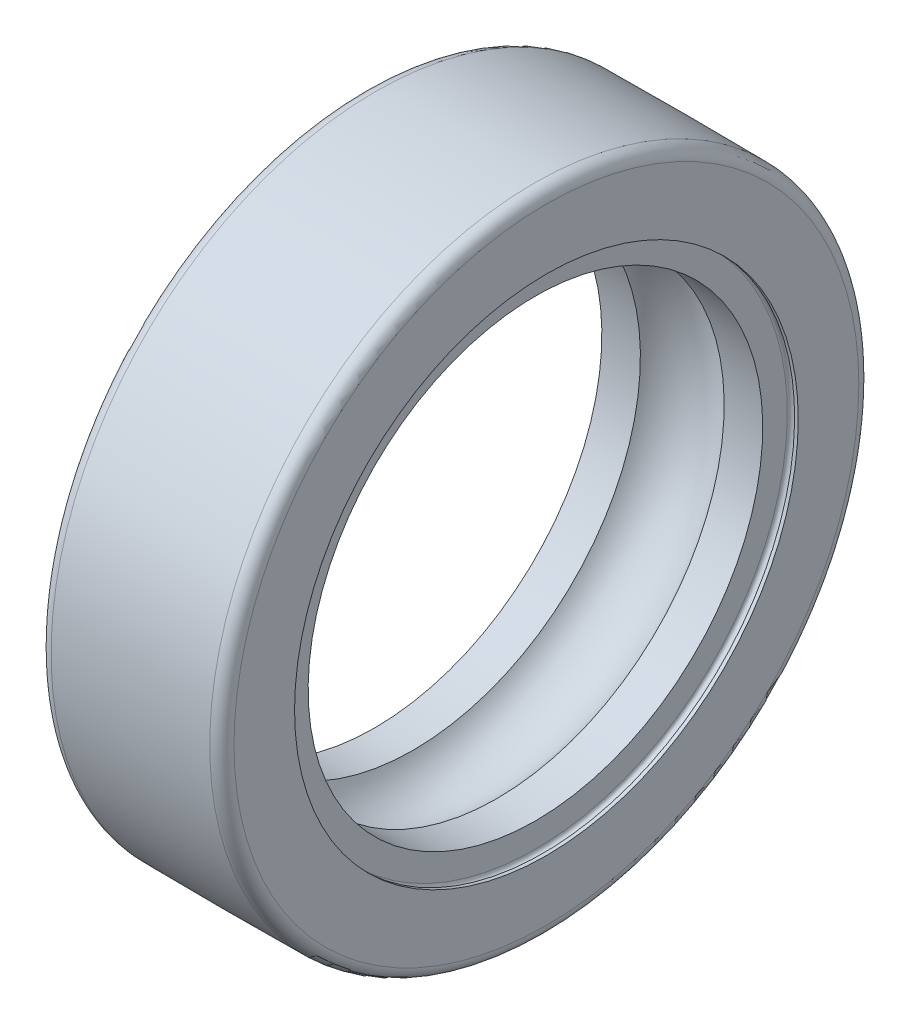
ISO-10303-21;
HEADER;
FILE_DESCRIPTION(('STEP AP214'),'2;1');
FILE_NAME('part.step','',(''),(''),'','','');
FILE_SCHEMA(('AUTOMOTIVE_DESIGN { 1 0 10303 214 1 1 1 1 }'));
ENDSEC;
DATA;
#1=APPLICATION_CONTEXT('core data for automotive mechanical design processes');
#2=APPLICATION_PROTOCOL_DEFINITION('international standard','automotive_design',2000,#1);
#3=PRODUCT_CONTEXT('',#1,'mechanical');
#4=PRODUCT('Part','Part','',(#3));
#5=PRODUCT_RELATED_PRODUCT_CATEGORY('part','',(#4));
#6=PRODUCT_DEFINITION_FORMATION('','',#4);
#7=PRODUCT_DEFINITION_CONTEXT('part definition',#1,'design');
#8=PRODUCT_DEFINITION('design','',#6,#7);
#9=PRODUCT_DEFINITION_SHAPE('','',#8);
#10=(LENGTH_UNIT() NAMED_UNIT(*) SI_UNIT(.MILLI.,.METRE.));
#11=(NAMED_UNIT(*) PLANE_ANGLE_UNIT() SI_UNIT($,.RADIAN.));
#12=(NAMED_UNIT(*) SI_UNIT($,.STERADIAN.) SOLID_ANGLE_UNIT());
#13=UNCERTAINTY_MEASURE_WITH_UNIT(LENGTH_MEASURE(1.E-05),#10,'distance_accuracy_value','');
#14=(GEOMETRIC_REPRESENTATION_CONTEXT(3) GLOBAL_UNCERTAINTY_ASSIGNED_CONTEXT((#13)) GLOBAL_UNIT_ASSIGNED_CONTEXT((#10,
#11,#12)) REPRESENTATION_CONTEXT('',''));
#15=CARTESIAN_POINT('',(0.,0.,0.));
#16=DIRECTION('',(0.,0.,1.));
#17=DIRECTION('',(1.,0.,0.));
#18=AXIS2_PLACEMENT_3D('',#15,#16,#17);
#19=CARTESIAN_POINT('',(4.5,0.,0.));
#20=DIRECTION('',(-1.,0.,0.));
#21=DIRECTION('',(0.,1.,0.));
#22=AXIS2_PLACEMENT_3D('',#19,#20,#21);
#23=CYLINDRICAL_SURFACE('',#22,11.1905);
#24=CARTESIAN_POINT('',(2.43799351358925,0.,0.));
#25=DIRECTION('',(1.,0.,0.));
#26=DIRECTION('',(0.,1.,0.));
#27=AXIS2_PLACEMENT_3D('',#24,#25,#26);
#28=CIRCLE('',#27,11.1905);
#29=CARTESIAN_POINT('',(2.43799351358925,-11.1905,0.));
#30=VERTEX_POINT('',#29);
#31=EDGE_CURVE('E122',#30,#30,#28,.T.);
#32=ORIENTED_EDGE('',*,*,#31,.T.);
#33=EDGE_LOOP('',(#32));
#34=FACE_BOUND('',#33,.T.);
#35=CARTESIAN_POINT('',(0.54,0.,0.));
#36=DIRECTION('',(-1.,0.,0.));
#37=DIRECTION('',(0.,1.,0.));
#38=AXIS2_PLACEMENT_3D('',#35,#36,#37);
#39=CIRCLE('',#38,11.1905);
#40=CARTESIAN_POINT('',(0.54,-11.1905,0.));
#41=VERTEX_POINT('',#40);
#42=EDGE_CURVE('E87',#41,#41,#39,.T.);
#43=ORIENTED_EDGE('',*,*,#42,.T.);
#44=EDGE_LOOP('',(#43));
#45=FACE_BOUND('',#44,.T.);
#46=ADVANCED_FACE('F41',(#34,#45),#23,.F.);
#47=CARTESIAN_POINT('',(9.,13.2857292422513,0.));
#48=DIRECTION('',(1.,0.,0.));
#49=DIRECTION('',(0.,1.,0.));
#50=AXIS2_PLACEMENT_3D('',#47,#48,#49);
#51=PLANE('',#50);
#52=CARTESIAN_POINT('',(9.,0.,0.));
#53=DIRECTION('',(1.,0.,0.));
#54=DIRECTION('',(0.,1.,0.));
#55=AXIS2_PLACEMENT_3D('',#52,#53,#54);
#56=CIRCLE('',#55,15.3809584845026);
#57=CARTESIAN_POINT('',(9.,15.3809584845026,0.));
#58=VERTEX_POINT('',#57);
#59=EDGE_CURVE('E11',#58,#58,#56,.T.);
#60=ORIENTED_EDGE('',*,*,#59,.T.);
#61=EDGE_LOOP('',(#60));
#62=FACE_BOUND('',#61,.T.);
#63=CARTESIAN_POINT('',(9.,0.,0.));
#64=DIRECTION('',(-1.,0.,0.));
#65=DIRECTION('',(0.,1.,0.));
#66=AXIS2_PLACEMENT_3D('',#63,#64,#65);
#67=CIRCLE('',#66,12.4);
#68=CARTESIAN_POINT('',(9.,-12.4,0.));
#69=VERTEX_POINT('',#68);
#70=EDGE_CURVE('E42',#69,#69,#67,.T.);
#71=ORIENTED_EDGE('',*,*,#70,.T.);
#72=EDGE_LOOP('',(#71));
#73=FACE_BOUND('',#72,.T.);
#74=ADVANCED_FACE('F143',(#62,#73),#51,.T.);
#75=CARTESIAN_POINT('',(8.4,0.,0.));
#76=DIRECTION('',(1.,0.,0.));
#77=DIRECTION('',(0.,0.,-1.));
#78=AXIS2_PLACEMENT_3D('',#75,#76,#77);
#79=TOROIDAL_SURFACE('',#78,15.3809584845026,0.6);
#80=CARTESIAN_POINT('',(8.40585878818225,0.,0.));
#81=DIRECTION('',(1.,0.,0.));
#82=DIRECTION('',(0.,1.,0.));
#83=AXIS2_PLACEMENT_3D('',#80,#81,#82);
#84=CIRCLE('',#83,15.9809298793216);
#85=CARTESIAN_POINT('',(8.40585878818225,15.9809298793216,0.));
#86=VERTEX_POINT('',#85);
#87=EDGE_CURVE('E49',#86,#86,#84,.T.);
#88=ORIENTED_EDGE('',*,*,#87,.T.);
#89=EDGE_LOOP('',(#88));
#90=FACE_BOUND('',#89,.T.);
#91=ORIENTED_EDGE('',*,*,#59,.F.);
#92=EDGE_LOOP('',(#91));
#93=FACE_BOUND('',#92,.T.);
#94=ADVANCED_FACE('F149',(#90,#93),#79,.T.);
#95=CARTESIAN_POINT('',(4.49999999999993,0.,0.));
#96=DIRECTION('',(1.,0.,0.));
#97=DIRECTION('',(0.,0.,1.));
#98=AXIS2_PLACEMENT_3D('',#95,#96,#97);
#99=DEGENERATE_TOROIDAL_SURFACE('',#98,384.,400.,.F.);
#100=CARTESIAN_POINT('',(0.594141211817752,0.,0.));
#101=DIRECTION('',(1.,0.,0.));
#102=DIRECTION('',(0.,1.,0.));
#103=AXIS2_PLACEMENT_3D('',#100,#101,#102);
#104=CIRCLE('',#103,15.9809298793216);
#105=CARTESIAN_POINT('',(0.594141211817752,15.9809298793216,0.));
#106=VERTEX_POINT('',#105);
#107=EDGE_CURVE('E106',#106,#106,#104,.T.);
#108=ORIENTED_EDGE('',*,*,#107,.T.);
#109=EDGE_LOOP('',(#108));
#110=FACE_BOUND('',#109,.T.);
#111=ORIENTED_EDGE('',*,*,#87,.F.);
#112=EDGE_LOOP('',(#111));
#113=FACE_BOUND('',#112,.T.);
#114=ADVANCED_FACE('F155',(#110,#113),#99,.F.);
#115=CARTESIAN_POINT('',(0.6,0.,0.));
#116=DIRECTION('',(1.,0.,0.));
#117=DIRECTION('',(0.,0.,-1.));
#118=AXIS2_PLACEMENT_3D('',#115,#116,#117);
#119=TOROIDAL_SURFACE('',#118,15.3809584845026,0.6);
#120=CARTESIAN_POINT('',(0.,0.,0.));
#121=DIRECTION('',(1.,0.,0.));
#122=DIRECTION('',(0.,1.,0.));
#123=AXIS2_PLACEMENT_3D('',#120,#121,#122);
#124=CIRCLE('',#123,15.3809584845026);
#125=CARTESIAN_POINT('',(0.,15.3809584845026,0.));
#126=VERTEX_POINT('',#125);
#127=EDGE_CURVE('E110',#126,#126,#124,.T.);
#128=ORIENTED_EDGE('',*,*,#127,.T.);
#129=EDGE_LOOP('',(#128));
#130=FACE_BOUND('',#129,.T.);
#131=ORIENTED_EDGE('',*,*,#107,.F.);
#132=EDGE_LOOP('',(#131));
#133=FACE_BOUND('',#132,.T.);
#134=ADVANCED_FACE('F170',(#130,#133),#119,.T.);
#135=CARTESIAN_POINT('',(0.,13.2857292422513,0.));
#136=DIRECTION('',(-1.,0.,0.));
#137=DIRECTION('',(0.,-1.,0.));
#138=AXIS2_PLACEMENT_3D('',#135,#136,#137);
#139=PLANE('',#138);
#140=ORIENTED_EDGE('',*,*,#127,.F.);
#141=EDGE_LOOP('',(#140));
#142=FACE_BOUND('',#141,.T.);
#143=CARTESIAN_POINT('',(0.,0.,0.));
#144=DIRECTION('',(1.,0.,0.));
#145=DIRECTION('',(0.,1.,0.));
#146=AXIS2_PLACEMENT_3D('',#143,#144,#145);
#147=CIRCLE('',#146,12.4);
#148=CARTESIAN_POINT('',(0.,-12.4,0.));
#149=VERTEX_POINT('',#148);
#150=EDGE_CURVE('E83',#149,#149,#147,.T.);
#151=ORIENTED_EDGE('',*,*,#150,.T.);
#152=EDGE_LOOP('',(#151));
#153=FACE_BOUND('',#152,.T.);
#154=ADVANCED_FACE('F137',(#142,#153),#139,.T.);
#155=CARTESIAN_POINT('',(4.5,0.,0.));
#156=DIRECTION('',(-1.,0.,0.));
#157=DIRECTION('',(0.,1.,0.));
#158=AXIS2_PLACEMENT_3D('',#155,#156,#157);
#159=CYLINDRICAL_SURFACE('',#158,11.1905);
#160=CARTESIAN_POINT('',(6.56200648641075,0.,0.));
#161=DIRECTION('',(-1.,0.,0.));
#162=DIRECTION('',(0.,1.,0.));
#163=AXIS2_PLACEMENT_3D('',#160,#161,#162);
#164=CIRCLE('',#163,11.1905);
#165=CARTESIAN_POINT('',(6.56200648641075,-11.1905,0.));
#166=VERTEX_POINT('',#165);
#167=EDGE_CURVE('E108',#166,#166,#164,.T.);
#168=ORIENTED_EDGE('',*,*,#167,.T.);
#169=EDGE_LOOP('',(#168));
#170=FACE_BOUND('',#169,.T.);
#171=CARTESIAN_POINT('',(8.46,0.,0.));
#172=DIRECTION('',(1.,0.,0.));
#173=DIRECTION('',(0.,1.,0.));
#174=AXIS2_PLACEMENT_3D('',#171,#172,#173);
#175=CIRCLE('',#174,11.1905);
#176=CARTESIAN_POINT('',(8.46,-11.1905,0.));
#177=VERTEX_POINT('',#176);
#178=EDGE_CURVE('E105',#177,#177,#175,.T.);
#179=ORIENTED_EDGE('',*,*,#178,.T.);
#180=EDGE_LOOP('',(#179));
#181=FACE_BOUND('',#180,.T.);
#182=ADVANCED_FACE('F127',(#170,#181),#159,.F.);
#183=CARTESIAN_POINT('',(4.5,0.,0.));
#184=DIRECTION('',(1.,0.,0.));
#185=DIRECTION('',(0.,0.,-1.));
#186=AXIS2_PLACEMENT_3D('',#183,#184,#185);
#187=TOROIDAL_SURFACE('',#186,10.,2.381);
#188=ORIENTED_EDGE('',*,*,#167,.F.);
#189=EDGE_LOOP('',(#188));
#190=FACE_BOUND('',#189,.T.);
#191=ORIENTED_EDGE('',*,*,#31,.F.);
#192=EDGE_LOOP('',(#191));
#193=FACE_BOUND('',#192,.T.);
#194=ADVANCED_FACE('F130',(#190,#193),#187,.F.);
#195=CARTESIAN_POINT('',(-0.455,0.,0.));
#196=DIRECTION('',(-1.,0.,0.));
#197=DIRECTION('',(0.,1.,0.));
#198=AXIS2_PLACEMENT_3D('',#195,#196,#197);
#199=CYLINDRICAL_SURFACE('',#198,12.4);
#200=CARTESIAN_POINT('',(0.18,0.,0.));
#201=DIRECTION('',(1.,0.,0.));
#202=DIRECTION('',(0.,1.,0.));
#203=AXIS2_PLACEMENT_3D('',#200,#201,#202);
#204=CIRCLE('',#203,12.4);
#205=CARTESIAN_POINT('',(0.18,12.4,0.));
#206=VERTEX_POINT('',#205);
#207=EDGE_CURVE('E116',#206,#206,#204,.T.);
#208=ORIENTED_EDGE('',*,*,#207,.T.);
#209=EDGE_LOOP('',(#208));
#210=FACE_BOUND('',#209,.T.);
#211=ORIENTED_EDGE('',*,*,#150,.F.);
#212=EDGE_LOOP('',(#211));
#213=FACE_BOUND('',#212,.T.);
#214=ADVANCED_FACE('F129',(#210,#213),#199,.F.);
#215=CARTESIAN_POINT('',(0.54,10.019,0.));
#216=DIRECTION('',(1.,0.,0.));
#217=DIRECTION('',(0.,1.,0.));
#218=AXIS2_PLACEMENT_3D('',#215,#216,#217);
#219=PLANE('',#218);
#220=CARTESIAN_POINT('',(0.54,0.,0.));
#221=DIRECTION('',(1.,0.,0.));
#222=DIRECTION('',(0.,1.,0.));
#223=AXIS2_PLACEMENT_3D('',#220,#221,#222);
#224=CIRCLE('',#223,12.4);
#225=CARTESIAN_POINT('',(0.54,12.4,0.));
#226=VERTEX_POINT('',#225);
#227=EDGE_CURVE('E107',#226,#226,#224,.T.);
#228=ORIENTED_EDGE('',*,*,#227,.F.);
#229=EDGE_LOOP('',(#228));
#230=FACE_BOUND('',#229,.T.);
#231=ORIENTED_EDGE('',*,*,#42,.F.);
#232=EDGE_LOOP('',(#231));
#233=FACE_BOUND('',#232,.T.);
#234=ADVANCED_FACE('F136',(#230,#233),#219,.F.);
#235=CARTESIAN_POINT('',(0.36,0.,0.));
#236=DIRECTION('',(1.,0.,0.));
#237=DIRECTION('',(0.,0.,-1.));
#238=AXIS2_PLACEMENT_3D('',#235,#236,#237);
#239=TOROIDAL_SURFACE('',#238,12.4,0.18);
#240=ORIENTED_EDGE('',*,*,#207,.F.);
#241=EDGE_LOOP('',(#240));
#242=FACE_BOUND('',#241,.T.);
#243=ORIENTED_EDGE('',*,*,#227,.T.);
#244=EDGE_LOOP('',(#243));
#245=FACE_BOUND('',#244,.T.);
#246=ADVANCED_FACE('F163',(#242,#245),#239,.F.);
#247=CARTESIAN_POINT('',(9.455,0.,0.));
#248=DIRECTION('',(1.,0.,0.));
#249=DIRECTION('',(0.,1.,0.));
#250=AXIS2_PLACEMENT_3D('',#247,#248,#249);
#251=CYLINDRICAL_SURFACE('',#250,12.4);
#252=CARTESIAN_POINT('',(8.82,0.,0.));
#253=DIRECTION('',(-1.,0.,0.));
#254=DIRECTION('',(0.,1.,0.));
#255=AXIS2_PLACEMENT_3D('',#252,#253,#254);
#256=CIRCLE('',#255,12.4);
#257=CARTESIAN_POINT('',(8.82,12.4,0.));
#258=VERTEX_POINT('',#257);
#259=EDGE_CURVE('E99',#258,#258,#256,.T.);
#260=ORIENTED_EDGE('',*,*,#259,.T.);
#261=EDGE_LOOP('',(#260));
#262=FACE_BOUND('',#261,.T.);
#263=ORIENTED_EDGE('',*,*,#70,.F.);
#264=EDGE_LOOP('',(#263));
#265=FACE_BOUND('',#264,.T.);
#266=ADVANCED_FACE('F164',(#262,#265),#251,.F.);
#267=CARTESIAN_POINT('',(8.46,10.019,0.));
#268=DIRECTION('',(-1.,0.,0.));
#269=DIRECTION('',(0.,1.,0.));
#270=AXIS2_PLACEMENT_3D('',#267,#268,#269);
#271=PLANE('',#270);
#272=CARTESIAN_POINT('',(8.46,0.,0.));
#273=DIRECTION('',(-1.,0.,0.));
#274=DIRECTION('',(0.,1.,0.));
#275=AXIS2_PLACEMENT_3D('',#272,#273,#274);
#276=CIRCLE('',#275,12.4);
#277=CARTESIAN_POINT('',(8.46,12.4,0.));
#278=VERTEX_POINT('',#277);
#279=EDGE_CURVE('E100',#278,#278,#276,.T.);
#280=ORIENTED_EDGE('',*,*,#279,.F.);
#281=EDGE_LOOP('',(#280));
#282=FACE_BOUND('',#281,.T.);
#283=ORIENTED_EDGE('',*,*,#178,.F.);
#284=EDGE_LOOP('',(#283));
#285=FACE_BOUND('',#284,.T.);
#286=ADVANCED_FACE('F159',(#282,#285),#271,.F.);
#287=CARTESIAN_POINT('',(8.64,0.,0.));
#288=DIRECTION('',(-1.,0.,0.));
#289=DIRECTION('',(0.,0.,1.));
#290=AXIS2_PLACEMENT_3D('',#287,#288,#289);
#291=TOROIDAL_SURFACE('',#290,12.4,0.18);
#292=ORIENTED_EDGE('',*,*,#259,.F.);
#293=EDGE_LOOP('',(#292));
#294=FACE_BOUND('',#293,.T.);
#295=ORIENTED_EDGE('',*,*,#279,.T.);
#296=EDGE_LOOP('',(#295));
#297=FACE_BOUND('',#296,.T.);
#298=ADVANCED_FACE('F97',(#294,#297),#291,.F.);
#299=CLOSED_SHELL('',(#46,#74,#94,#114,#134,#154,#182,#194,#214,#234,#246,#266,#286,#298));
#300=MANIFOLD_SOLID_BREP('B2',#299);
#301=ADVANCED_BREP_SHAPE_REPRESENTATION('',(#18,#300),#14);
#302=SHAPE_DEFINITION_REPRESENTATION(#9,#301);
ENDSEC;
END-ISO-10303-21;
